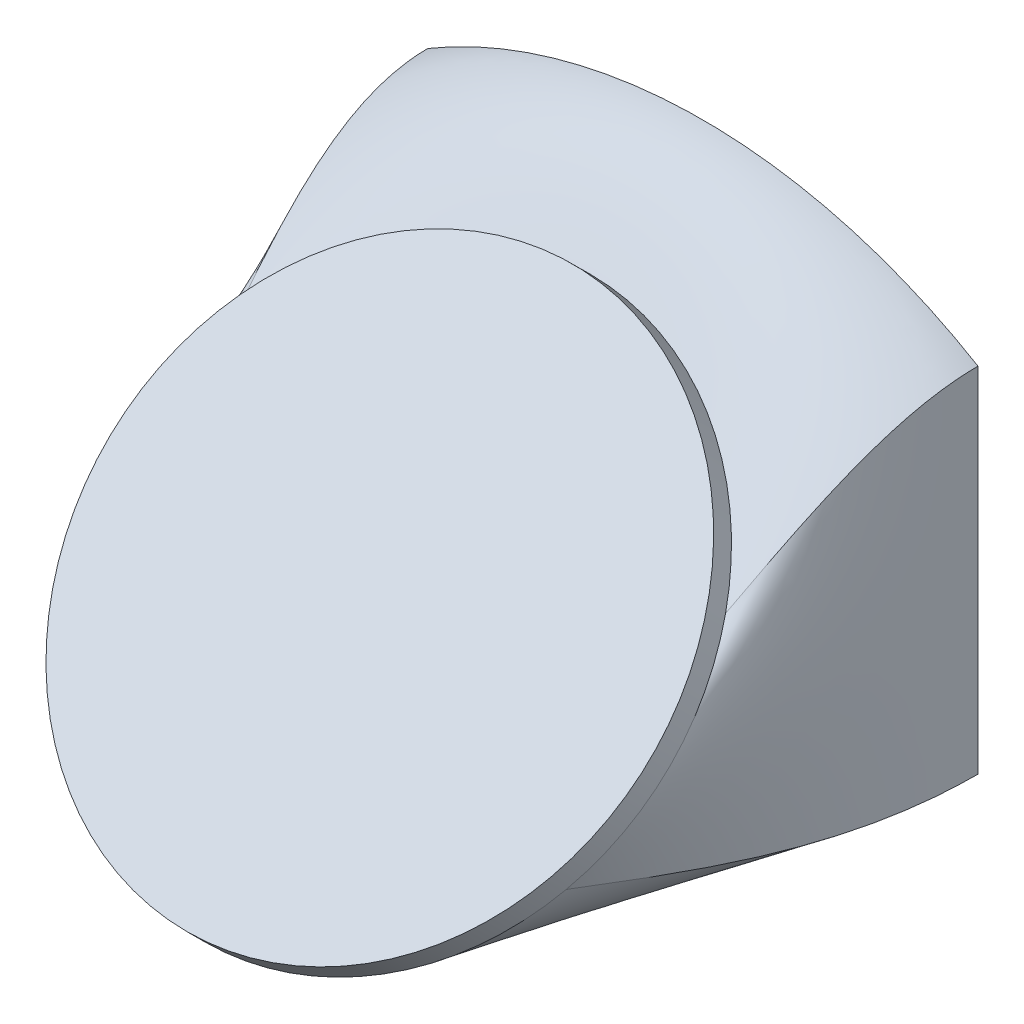
ISO-10303-21;
HEADER;
FILE_DESCRIPTION(('STEP AP214'),'2;1');
FILE_NAME('part.step','',(''),(''),'','','');
FILE_SCHEMA(('AUTOMOTIVE_DESIGN { 1 0 10303 214 1 1 1 1 }'));
ENDSEC;
DATA;
#1=APPLICATION_CONTEXT('core data for automotive mechanical design processes');
#2=APPLICATION_PROTOCOL_DEFINITION('international standard','automotive_design',2000,#1);
#3=PRODUCT_CONTEXT('',#1,'mechanical');
#4=PRODUCT('Part','Part','',(#3));
#5=PRODUCT_RELATED_PRODUCT_CATEGORY('part','',(#4));
#6=PRODUCT_DEFINITION_FORMATION('','',#4);
#7=PRODUCT_DEFINITION_CONTEXT('part definition',#1,'design');
#8=PRODUCT_DEFINITION('design','',#6,#7);
#9=PRODUCT_DEFINITION_SHAPE('','',#8);
#10=(LENGTH_UNIT() NAMED_UNIT(*) SI_UNIT(.MILLI.,.METRE.));
#11=(NAMED_UNIT(*) PLANE_ANGLE_UNIT() SI_UNIT($,.RADIAN.));
#12=(NAMED_UNIT(*) SI_UNIT($,.STERADIAN.) SOLID_ANGLE_UNIT());
#13=UNCERTAINTY_MEASURE_WITH_UNIT(LENGTH_MEASURE(1.E-05),#10,'distance_accuracy_value','');
#14=(GEOMETRIC_REPRESENTATION_CONTEXT(3) GLOBAL_UNCERTAINTY_ASSIGNED_CONTEXT((#13)) GLOBAL_UNIT_ASSIGNED_CONTEXT((#10,
#11,#12)) REPRESENTATION_CONTEXT('',''));
#15=CARTESIAN_POINT('',(0.,0.,0.));
#16=DIRECTION('',(0.,0.,1.));
#17=DIRECTION('',(1.,0.,0.));
#18=AXIS2_PLACEMENT_3D('',#15,#16,#17);
#19=CARTESIAN_POINT('',(0.,56.5083333333335,0.));
#20=DIRECTION('',(0.,0.,1.));
#21=DIRECTION('',(1.,0.,0.));
#22=AXIS2_PLACEMENT_3D('',#19,#20,#21);
#23=PLANE('',#22);
#24=CARTESIAN_POINT('',(0.,56.5083333333335,0.));
#25=DIRECTION('',(0.,0.,1.));
#26=DIRECTION('',(1.,0.,0.));
#27=AXIS2_PLACEMENT_3D('',#24,#25,#26);
#28=CIRCLE('',#27,106.508333333334);
#29=CARTESIAN_POINT('',(-54.5,-35.,0.));
#30=VERTEX_POINT('',#29);
#31=CARTESIAN_POINT('',(54.5,-35.,0.));
#32=VERTEX_POINT('',#31);
#33=EDGE_CURVE('E213',#30,#32,#28,.T.);
#34=ORIENTED_EDGE('',*,*,#33,.F.);
#35=DIRECTION('',(0.,-1.,0.));
#36=VECTOR('',#35,1.);
#37=CARTESIAN_POINT('',(-54.5,35.,0.));
#38=LINE('',#37,#36);
#39=CARTESIAN_POINT('',(-54.5,35.,0.));
#40=VERTEX_POINT('',#39);
#41=EDGE_CURVE('E12',#40,#30,#38,.T.);
#42=ORIENTED_EDGE('',*,*,#41,.F.);
#43=CARTESIAN_POINT('',(0.,-56.5083333333334,0.));
#44=DIRECTION('',(0.,0.,1.));
#45=DIRECTION('',(-1.,0.,0.));
#46=AXIS2_PLACEMENT_3D('',#43,#44,#45);
#47=CIRCLE('',#46,106.508333333333);
#48=CARTESIAN_POINT('',(54.5,35.,0.));
#49=VERTEX_POINT('',#48);
#50=EDGE_CURVE('E139',#49,#40,#47,.T.);
#51=ORIENTED_EDGE('',*,*,#50,.F.);
#52=DIRECTION('',(0.,1.,0.));
#53=VECTOR('',#52,1.);
#54=CARTESIAN_POINT('',(54.5,35.,0.));
#55=LINE('',#54,#53);
#56=EDGE_CURVE('E294',#32,#49,#55,.T.);
#57=ORIENTED_EDGE('',*,*,#56,.F.);
#58=EDGE_LOOP('',(#34,#42,#51,#57));
#59=FACE_BOUND('',#58,.T.);
#60=ADVANCED_FACE('F129',(#59),#23,.F.);
#61=CARTESIAN_POINT('',(49.1679396402326,12.2523366207476,44.6765955673871));
#62=CARTESIAN_POINT('',(51.8339698201163,23.6261683103738,30.7411498927294));
#63=CARTESIAN_POINT('',(54.5,35.,16.8057042180718));
#64=CARTESIAN_POINT('',(54.5,35.,0.));
#65=CARTESIAN_POINT('',(55.610300295625,2.22066074306521,54.7082714450694));
#66=CARTESIAN_POINT('',(55.0551501478125,6.94366370486594,37.2910102358226));
#67=CARTESIAN_POINT('',(54.5,11.6666666666667,19.8737490265758));
#68=CARTESIAN_POINT('',(54.5,11.6666666666667,0.));
#69=CARTESIAN_POINT('',(55.610300295625,-9.29172855493061,66.2206607430652));
#70=CARTESIAN_POINT('',(55.0551501478125,-10.4791976107986,44.5812272890725));
#71=CARTESIAN_POINT('',(54.5,-11.6666666666667,22.9417938350798));
#72=CARTESIAN_POINT('',(54.5,-11.6666666666667,0.));
#73=CARTESIAN_POINT('',(49.1679396402327,-19.323404432613,76.2523366207475));
#74=CARTESIAN_POINT('',(51.8339698201163,-27.1617022163065,51.1310876321657));
#75=CARTESIAN_POINT('',(54.5,-35.,26.0098386435839));
#76=CARTESIAN_POINT('',(54.5,-35.,0.));
#77=B_SPLINE_SURFACE_WITH_KNOTS('',3,3,((#61,#62,#63,#64),(#65,#66,#67,#68),(#69,#70,#71,#72),
(#73,#74,#75,#76)),.UNSPECIFIED.,.F.,.F.,.F.,(4,4),(4,4),(0.,1.),(0.,1.),.UNSPECIFIED.);
#78=CARTESIAN_POINT('',(0.,-3.53553390593271,60.4644660940673));
#79=DIRECTION('',(0.,-0.707106781186546,-0.707106781186549));
#80=DIRECTION('',(0.,0.707106781186549,-0.707106781186546));
#81=AXIS2_PLACEMENT_3D('',#78,#79,#80);
#82=CIRCLE('',#81,54.);
#83=CARTESIAN_POINT('',(49.1679396402327,12.2523366207476,44.676595567387));
#84=VERTEX_POINT('',#83);
#85=CARTESIAN_POINT('',(53.4481201590153,1.91123804463501,55.0176941434996));
#86=VERTEX_POINT('',#85);
#87=EDGE_CURVE('E195',#84,#86,#82,.T.);
#88=CARTESIAN_POINT('',(0.,-3.53553390593271,60.4644660940673));
#89=DIRECTION('',(0.,0.707106781186546,0.707106781186549));
#90=DIRECTION('',(0.,-0.707106781186549,0.707106781186546));
#91=AXIS2_PLACEMENT_3D('',#88,#89,#90);
#92=CIRCLE('',#91,54.);
#93=CARTESIAN_POINT('',(49.1679396402327,-19.323404432613,76.2523366207475));
#94=VERTEX_POINT('',#93);
#95=EDGE_CURVE('E188',#94,#86,#92,.T.);
#96=CARTESIAN_POINT('',(49.1679396402327,-19.323404432613,76.2523366207475));
#97=CARTESIAN_POINT('',(51.8339698201163,-27.1617022163065,51.1310876321657));
#98=CARTESIAN_POINT('',(54.5,-35.,26.0098386435839));
#99=CARTESIAN_POINT('',(54.5,-35.,0.));
#100=B_SPLINE_CURVE_WITH_KNOTS('',3,(#96,#97,#98,#99),.UNSPECIFIED.,.F.,.F.,(4,4),(0.,1.),.UNSPECIFIED.);
#101=EDGE_CURVE('E204',#94,#32,#100,.T.);
#102=CARTESIAN_POINT('',(49.1679396402326,12.2523366207476,44.6765955673871));
#103=CARTESIAN_POINT('',(51.8339698201163,23.6261683103738,30.7411498927294));
#104=CARTESIAN_POINT('',(54.5,35.,16.8057042180718));
#105=CARTESIAN_POINT('',(54.5,35.,0.));
#106=B_SPLINE_CURVE_WITH_KNOTS('',3,(#102,#103,#104,#105),.UNSPECIFIED.,.F.,.F.,(4,4),(0.,1.),.UNSPECIFIED.);
#107=EDGE_CURVE('E215',#49,#84,#106,.F.);
#108=ORIENTED_EDGE('',*,*,#87,.T.);
#109=ORIENTED_EDGE('',*,*,#95,.F.);
#110=ORIENTED_EDGE('',*,*,#101,.T.);
#111=ORIENTED_EDGE('',*,*,#56,.T.);
#112=ORIENTED_EDGE('',*,*,#107,.T.);
#113=EDGE_LOOP('',(#108,#109,#110,#111,#112));
#114=FACE_BOUND('',#113,.T.);
#115=ADVANCED_FACE('F202',(#114),#77,.T.);
#116=CARTESIAN_POINT('',(49.1679396402327,-19.323404432613,76.2523366207475));
#117=CARTESIAN_POINT('',(51.8339698201163,-27.1617022163065,51.1310876321657));
#118=CARTESIAN_POINT('',(54.5,-35.,26.0098386435839));
#119=CARTESIAN_POINT('',(54.5,-35.,0.));
#120=CARTESIAN_POINT('',(48.073339624932,-21.0278530278668,77.9567852160013));
#121=CARTESIAN_POINT('',(50.2374276584303,-28.6388280427007,52.2312643576387));
#122=CARTESIAN_POINT('',(52.4015156919287,-36.2498030575345,26.505743499276));
#123=CARTESIAN_POINT('',(52.4015156919287,-36.2498030575345,0.));
#124=CARTESIAN_POINT('',(45.5571007663625,-24.2843976600411,81.2133298481757));
#125=CARTESIAN_POINT('',(46.8485084788376,-31.4387907252264,54.3554415294181));
#126=CARTESIAN_POINT('',(48.1399161913127,-38.5931837904117,27.4975532106604));
#127=CARTESIAN_POINT('',(48.1399161913127,-38.5931837904117,0.));
#128=CARTESIAN_POINT('',(40.899220883751,-28.6666292962474,85.5955614843818));
#129=CARTESIAN_POINT('',(41.2385408761988,-35.1531040196998,57.2247483336345));
#130=CARTESIAN_POINT('',(41.5778608686466,-41.6395787431521,28.8539351828873));
#131=CARTESIAN_POINT('',(41.5778608686466,-41.6395787431521,0.));
#132=CARTESIAN_POINT('',(35.4617114194411,-32.5007479833435,89.4296801714781));
#133=CARTESIAN_POINT('',(35.1660487376783,-38.3590227663302,59.7464935191303));
#134=CARTESIAN_POINT('',(34.8703860559156,-44.217297549317,30.0633068667825));
#135=CARTESIAN_POINT('',(34.8703860559156,-44.217297549317,0.));
#136=CARTESIAN_POINT('',(29.3372660159594,-35.7412260842746,92.670158272409));
#137=CARTESIAN_POINT('',(28.6894971753783,-41.0337831465905,61.8814100326841));
#138=CARTESIAN_POINT('',(28.0417283347972,-46.3263402089065,31.0926617929592));
#139=CARTESIAN_POINT('',(28.0417283347972,-46.3263402089065,0.));
#140=CARTESIAN_POINT('',(22.6393007026018,-38.3425359619853,95.2714681501198));
#141=CARTESIAN_POINT('',(21.8777124947854,-43.1546213419529,63.5968208403101));
#142=CARTESIAN_POINT('',(21.116124286969,-47.9667067219206,31.9221735305004));
#143=CARTESIAN_POINT('',(21.116124286969,-47.9667067219206,0.));
#144=CARTESIAN_POINT('',(15.4425752631285,-40.259149979421,97.1880821675553));
#145=CARTESIAN_POINT('',(14.7801928786185,-44.6987735338901,64.860821942633));
#146=CARTESIAN_POINT('',(14.1178104941085,-49.1383970883592,32.5335617177107));
#147=CARTESIAN_POINT('',(14.1178104941085,-49.1383970883592,0.));
#148=CARTESIAN_POINT('',(7.8948919450744,-41.4455404995262,98.3744726876607));
#149=CARTESIAN_POINT('',(7.48295774148367,-45.6434759038743,65.6429879027502));
#150=CARTESIAN_POINT('',(7.07102353789294,-49.8414113082225,32.9115031178397));
#151=CARTESIAN_POINT('',(7.07102353789294,-49.8414113082225,0.));
#152=CARTESIAN_POINT('',(0.,-41.8561798852464,98.7851120733807));
#153=CARTESIAN_POINT('',(0.,-45.9659646333783,65.9134233925793));
#154=CARTESIAN_POINT('',(0.,-50.0757493815102,33.0417347117779));
#155=CARTESIAN_POINT('',(0.,-50.0757493815102,0.));
#156=CARTESIAN_POINT('',(-7.89489194507439,-41.4455404995263,98.3744726876608));
#157=CARTESIAN_POINT('',(-7.4829577414837,-45.6434759038744,65.6429879027503));
#158=CARTESIAN_POINT('',(-7.071023537893,-49.8414113082225,32.9115031178398));
#159=CARTESIAN_POINT('',(-7.071023537893,-49.8414113082225,0.));
#160=CARTESIAN_POINT('',(-15.4425752631284,-40.259149979421,97.1880821675553));
#161=CARTESIAN_POINT('',(-14.7801928786184,-44.6987735338901,64.860821942633));
#162=CARTESIAN_POINT('',(-14.1178104941085,-49.1383970883593,32.5335617177107));
#163=CARTESIAN_POINT('',(-14.1178104941085,-49.1383970883593,0.));
#164=CARTESIAN_POINT('',(-22.6393007026019,-38.3425359619853,95.2714681501199));
#165=CARTESIAN_POINT('',(-21.8777124947855,-43.154621341953,63.5968208403102));
#166=CARTESIAN_POINT('',(-21.1161242869691,-47.9667067219207,31.9221735305005));
#167=CARTESIAN_POINT('',(-21.1161242869691,-47.9667067219207,0.));
#168=CARTESIAN_POINT('',(-29.3372660159592,-35.7412260842747,92.6701582724089));
#169=CARTESIAN_POINT('',(-28.6894971753782,-41.0337831465906,61.881410032684));
#170=CARTESIAN_POINT('',(-28.0417283347973,-46.3263402089066,31.0926617929592));
#171=CARTESIAN_POINT('',(-28.0417283347973,-46.3263402089066,0.));
#172=CARTESIAN_POINT('',(-35.4617114194413,-32.5007479833435,89.4296801714783));
#173=CARTESIAN_POINT('',(-35.1660487376784,-38.3590227663303,59.7464935191304));
#174=CARTESIAN_POINT('',(-34.8703860559156,-44.2172975493171,30.0633068667825));
#175=CARTESIAN_POINT('',(-34.8703860559156,-44.2172975493171,0.));
#176=CARTESIAN_POINT('',(-40.8992208837508,-28.6666292962476,85.5955614843817));
#177=CARTESIAN_POINT('',(-41.2385408761987,-35.1531040196998,57.2247483336345));
#178=CARTESIAN_POINT('',(-41.5778608686466,-41.6395787431521,28.8539351828873));
#179=CARTESIAN_POINT('',(-41.5778608686466,-41.6395787431521,0.));
#180=CARTESIAN_POINT('',(-45.5571007663625,-24.2843976600411,81.2133298481758));
#181=CARTESIAN_POINT('',(-46.8485084788376,-31.4387907252264,54.3554415294181));
#182=CARTESIAN_POINT('',(-48.1399161913128,-38.5931837904117,27.4975532106604));
#183=CARTESIAN_POINT('',(-48.1399161913128,-38.5931837904117,0.));
#184=CARTESIAN_POINT('',(-48.073339624932,-21.0278530278669,77.9567852160014));
#185=CARTESIAN_POINT('',(-50.2374276584304,-28.6388280427007,52.2312643576387));
#186=CARTESIAN_POINT('',(-52.4015156919287,-36.2498030575345,26.5057434992761));
#187=CARTESIAN_POINT('',(-52.4015156919287,-36.2498030575345,0.));
#188=CARTESIAN_POINT('',(-49.1679396402326,-19.323404432613,76.2523366207475));
#189=CARTESIAN_POINT('',(-51.8339698201163,-27.1617022163065,51.1310876321657));
#190=CARTESIAN_POINT('',(-54.5,-35.,26.0098386435839));
#191=CARTESIAN_POINT('',(-54.5,-35.,0.));
#192=B_SPLINE_SURFACE_WITH_KNOTS('',3,3,((#116,#117,#118,#119),(#120,#121,#122,#123),(#124,#125,
#126,#127),(#128,#129,#130,#131),(#132,#133,#134,#135),(#136,#137,#138,#139),(#140,#141,#142,
#143),(#144,#145,#146,#147),(#148,#149,#150,#151),(#152,#153,#154,#155),(#156,#157,#158,#159),
(#160,#161,#162,#163),(#164,#165,#166,#167),(#168,#169,#170,#171),(#172,#173,#174,#175),(#176,
#177,#178,#179),(#180,#181,#182,#183),(#184,#185,#186,#187),(#188,#189,#190,#191)),
.UNSPECIFIED.,.F.,.F.,.F.,(4,1,1,1,1,1,1,1,1,1,1,1,1,1,1,1,4),(4,4),(0.,0.0625,0.125,0.1875,
0.25,0.3125,0.375,0.4375,0.5,0.5625,0.625,0.6875,0.75,0.8125,0.875,0.9375,1.),(0.,1.),.UNSPECIFIED.);
#193=CARTESIAN_POINT('',(-49.1679396402327,-19.323404432613,76.2523366207475));
#194=VERTEX_POINT('',#193);
#195=EDGE_CURVE('E183',#94,#194,#82,.T.);
#196=CARTESIAN_POINT('',(-49.1679396402326,-19.323404432613,76.2523366207475));
#197=CARTESIAN_POINT('',(-51.8339698201163,-27.1617022163065,51.1310876321657));
#198=CARTESIAN_POINT('',(-54.5,-35.,26.0098386435839));
#199=CARTESIAN_POINT('',(-54.5,-35.,0.));
#200=B_SPLINE_CURVE_WITH_KNOTS('',3,(#196,#197,#198,#199),.UNSPECIFIED.,.F.,.F.,(4,4),(0.,1.),.UNSPECIFIED.);
#201=EDGE_CURVE('E155',#194,#30,#200,.T.);
#202=ORIENTED_EDGE('',*,*,#195,.T.);
#203=ORIENTED_EDGE('',*,*,#201,.T.);
#204=ORIENTED_EDGE('',*,*,#33,.T.);
#205=ORIENTED_EDGE('',*,*,#101,.F.);
#206=EDGE_LOOP('',(#202,#203,#204,#205));
#207=FACE_BOUND('',#206,.T.);
#208=ADVANCED_FACE('F211',(#207),#192,.T.);
#209=CARTESIAN_POINT('',(-49.1679396402326,12.2523366207475,44.6765955673871));
#210=CARTESIAN_POINT('',(-51.8339698201163,23.6261683103738,30.7411498927294));
#211=CARTESIAN_POINT('',(-54.5,35.,16.8057042180718));
#212=CARTESIAN_POINT('',(-54.5,35.,0.));
#213=CARTESIAN_POINT('',(-48.073339624932,13.9567852160014,42.9721469721332));
#214=CARTESIAN_POINT('',(-50.2374276584303,25.103294136768,29.5953387366301));
#215=CARTESIAN_POINT('',(-52.4015156919286,36.2498030575345,16.218530501127));
#216=CARTESIAN_POINT('',(-52.4015156919286,36.2498030575345,0.));
#217=CARTESIAN_POINT('',(-45.5571007663626,17.2133298481757,39.7156023399589));
#218=CARTESIAN_POINT('',(-46.8485084788376,27.9032568192937,27.3798927035982));
#219=CARTESIAN_POINT('',(-48.1399161913127,38.5931837904118,15.0441830672375));
#220=CARTESIAN_POINT('',(-48.1399161913127,38.5931837904118,0.));
#221=CARTESIAN_POINT('',(-40.8992208837509,21.595561484382,35.3333707037527));
#222=CARTESIAN_POINT('',(-41.2385408761987,31.617570113767,24.4372512993189));
#223=CARTESIAN_POINT('',(-41.5778608686465,41.6395787431521,13.5411318948852));
#224=CARTESIAN_POINT('',(-41.5778608686465,41.6395787431521,0.));
#225=CARTESIAN_POINT('',(-35.4617114194412,25.4296801714782,31.4992520166564));
#226=CARTESIAN_POINT('',(-35.1660487376784,34.8234888603976,21.8616031457889));
#227=CARTESIAN_POINT('',(-34.8703860559155,44.217297549317,12.2239542749214));
#228=CARTESIAN_POINT('',(-34.8703860559155,44.217297549317,0.));
#229=CARTESIAN_POINT('',(-29.3372660159594,28.6701582724091,28.2587739157256));
#230=CARTESIAN_POINT('',(-28.6894971753783,37.4982492406578,19.6865889614701));
#231=CARTESIAN_POINT('',(-28.0417283347972,46.3263402089065,11.1144040072145));
#232=CARTESIAN_POINT('',(-28.0417283347972,46.3263402089065,0.));
#233=CARTESIAN_POINT('',(-22.6393007026018,31.27146815012,25.6574640380147));
#234=CARTESIAN_POINT('',(-21.8777124947854,39.6190874360203,17.9366278040711));
#235=CARTESIAN_POINT('',(-21.116124286969,47.9667067219206,10.2157915701274));
#236=CARTESIAN_POINT('',(-21.116124286969,47.9667067219206,0.));
#237=CARTESIAN_POINT('',(-15.4425752631285,33.1880821675554,23.7408500205793));
#238=CARTESIAN_POINT('',(-14.7801928786184,41.1632396279573,16.6422897701871));
#239=CARTESIAN_POINT('',(-14.1178104941084,49.1383970883593,9.54372951979502));
#240=CARTESIAN_POINT('',(-14.1178104941084,49.1383970883593,0.));
#241=CARTESIAN_POINT('',(-7.8948919450744,34.3744726876609,22.5544595004738));
#242=CARTESIAN_POINT('',(-7.48295774148367,42.1079419979417,15.8368829028073));
#243=CARTESIAN_POINT('',(-7.07102353789294,49.8414113082225,9.11930630514079));
#244=CARTESIAN_POINT('',(-7.07102353789294,49.8414113082225,0.));
#245=CARTESIAN_POINT('',(0.,34.7851120733809,22.1438201147538));
#246=CARTESIAN_POINT('',(0.,42.4304307274456,15.5561142888401));
#247=CARTESIAN_POINT('',(0.,50.0757493815103,8.96840846292647));
#248=CARTESIAN_POINT('',(0.,50.0757493815103,0.));
#249=CARTESIAN_POINT('',(7.8948919450744,34.3744726876609,22.5544595004739));
#250=CARTESIAN_POINT('',(7.4829577414837,42.1079419979417,15.8368829028073));
#251=CARTESIAN_POINT('',(7.07102353789299,49.8414113082226,9.11930630514081));
#252=CARTESIAN_POINT('',(7.07102353789299,49.8414113082226,0.));
#253=CARTESIAN_POINT('',(15.4425752631284,33.1880821675555,23.7408500205792));
#254=CARTESIAN_POINT('',(14.7801928786184,41.1632396279574,16.6422897701871));
#255=CARTESIAN_POINT('',(14.1178104941085,49.1383970883593,9.543729519795));
#256=CARTESIAN_POINT('',(14.1178104941085,49.1383970883593,0.));
#257=CARTESIAN_POINT('',(22.6393007026019,31.2714681501198,25.6574640380148));
#258=CARTESIAN_POINT('',(21.8777124947855,39.6190874360203,17.9366278040711));
#259=CARTESIAN_POINT('',(21.1161242869691,47.9667067219207,10.2157915701275));
#260=CARTESIAN_POINT('',(21.1161242869691,47.9667067219207,0.));
#261=CARTESIAN_POINT('',(29.3372660159592,28.6701582724093,28.2587739157255));
#262=CARTESIAN_POINT('',(28.6894971753782,37.4982492406579,19.68658896147));
#263=CARTESIAN_POINT('',(28.0417283347972,46.3263402089066,11.1144040072145));
#264=CARTESIAN_POINT('',(28.0417283347972,46.3263402089066,0.));
#265=CARTESIAN_POINT('',(35.4617114194413,25.4296801714781,31.4992520166565));
#266=CARTESIAN_POINT('',(35.1660487376784,34.8234888603976,21.861603145789));
#267=CARTESIAN_POINT('',(34.8703860559155,44.2172975493171,12.2239542749215));
#268=CARTESIAN_POINT('',(34.8703860559155,44.2172975493171,0.));
#269=CARTESIAN_POINT('',(40.8992208837508,21.5955614843821,35.3333707037527));
#270=CARTESIAN_POINT('',(41.2385408761987,31.6175701137671,24.4372512993189));
#271=CARTESIAN_POINT('',(41.5778608686465,41.6395787431521,13.5411318948851));
#272=CARTESIAN_POINT('',(41.5778608686465,41.6395787431521,0.));
#273=CARTESIAN_POINT('',(45.5571007663625,17.2133298481757,39.7156023399589));
#274=CARTESIAN_POINT('',(46.8485084788376,27.9032568192937,27.3798927035982));
#275=CARTESIAN_POINT('',(48.1399161913127,38.5931837904118,15.0441830672375));
#276=CARTESIAN_POINT('',(48.1399161913127,38.5931837904118,0.));
#277=CARTESIAN_POINT('',(48.073339624932,13.9567852160014,42.9721469721332));
#278=CARTESIAN_POINT('',(50.2374276584303,25.103294136768,29.5953387366301));
#279=CARTESIAN_POINT('',(52.4015156919286,36.2498030575345,16.218530501127));
#280=CARTESIAN_POINT('',(52.4015156919286,36.2498030575345,0.));
#281=CARTESIAN_POINT('',(49.1679396402326,12.2523366207476,44.6765955673871));
#282=CARTESIAN_POINT('',(51.8339698201163,23.6261683103738,30.7411498927294));
#283=CARTESIAN_POINT('',(54.5,35.,16.8057042180718));
#284=CARTESIAN_POINT('',(54.5,35.,0.));
#285=B_SPLINE_SURFACE_WITH_KNOTS('',3,3,((#209,#210,#211,#212),(#213,#214,#215,#216),(#217,#218,
#219,#220),(#221,#222,#223,#224),(#225,#226,#227,#228),(#229,#230,#231,#232),(#233,#234,#235,
#236),(#237,#238,#239,#240),(#241,#242,#243,#244),(#245,#246,#247,#248),(#249,#250,#251,#252),
(#253,#254,#255,#256),(#257,#258,#259,#260),(#261,#262,#263,#264),(#265,#266,#267,#268),(#269,
#270,#271,#272),(#273,#274,#275,#276),(#277,#278,#279,#280),(#281,#282,#283,#284)),
.UNSPECIFIED.,.F.,.F.,.F.,(4,1,1,1,1,1,1,1,1,1,1,1,1,1,1,1,4),(4,4),(0.,0.0625,0.125,0.1875,
0.25,0.3125,0.375,0.4375,0.5,0.5625,0.625,0.6875,0.75,0.8125,0.875,0.9375,1.),(0.,1.),.UNSPECIFIED.);
#286=CARTESIAN_POINT('',(-49.1679396402327,12.2523366207476,44.676595567387));
#287=VERTEX_POINT('',#286);
#288=CARTESIAN_POINT('',(-32.3814886689917,27.0206652356814,29.9082669524533));
#289=VERTEX_POINT('',#288);
#290=EDGE_CURVE('E433',#287,#289,#82,.T.);
#291=CARTESIAN_POINT('',(32.3814535617229,27.0207008444264,29.9082313437083));
#292=VERTEX_POINT('',#291);
#293=EDGE_CURVE('E364',#292,#289,#92,.T.);
#294=EDGE_CURVE('E207',#84,#292,#92,.T.);
#295=CARTESIAN_POINT('',(-49.1679396402327,12.2523366207476,44.676595567387));
#296=CARTESIAN_POINT('',(-51.8339698201163,23.6261683103738,30.7411498927294));
#297=CARTESIAN_POINT('',(-54.5,35.,16.8057042180718));
#298=CARTESIAN_POINT('',(-54.5,35.,0.));
#299=B_SPLINE_CURVE_WITH_KNOTS('',3,(#295,#296,#297,#298),.UNSPECIFIED.,.F.,.F.,(4,4),(0.,1.),.UNSPECIFIED.);
#300=EDGE_CURVE('E217',#287,#40,#299,.T.);
#301=CARTESIAN_POINT('',(-49.1675077433435,12.2504940600138,44.6788531095863));
#302=CARTESIAN_POINT('',(-49.1676517089732,12.2511082469251,44.6781005955199));
#303=CARTESIAN_POINT('',(-49.1677956746029,12.2517224338363,44.6773480814535));
#304=CARTESIAN_POINT('',(-49.1679396402326,12.2523366207475,44.6765955673871));
#305=CARTESIAN_POINT('',(-51.8339698201163,23.6261683103738,30.7411498927294));
#306=CARTESIAN_POINT('',(-54.5,35.,16.8057042180718));
#307=CARTESIAN_POINT('',(-54.5,35.,0.));
#308=CARTESIAN_POINT('',(-48.0729890426706,13.9549794815562,42.9743140150674));
#309=CARTESIAN_POINT('',(-48.0731059034244,13.955581393038,42.9735916674226));
#310=CARTESIAN_POINT('',(-48.0732227641782,13.9561833045197,42.9728693197779));
#311=CARTESIAN_POINT('',(-48.073339624932,13.9567852160014,42.9721469721332));
#312=CARTESIAN_POINT('',(-50.2374276584303,25.103294136768,29.5953387366301));
#313=CARTESIAN_POINT('',(-52.4015156919286,36.2498030575345,16.218530501127));
#314=CARTESIAN_POINT('',(-52.4015156919286,36.2498030575345,0.));
#315=CARTESIAN_POINT('',(-45.5568915583131,17.2115980800064,39.71760072492));
#316=CARTESIAN_POINT('',(-45.5569612943296,17.2121753360629,39.7169345965996));
#317=CARTESIAN_POINT('',(-45.5570310303461,17.2127525921193,39.7162684682793));
#318=CARTESIAN_POINT('',(-45.5571007663626,17.2133298481757,39.7156023399589));
#319=CARTESIAN_POINT('',(-46.8485084788376,27.9032568192937,27.3798927035982));
#320=CARTESIAN_POINT('',(-48.1399161913127,38.5931837904118,15.0441830672375));
#321=CARTESIAN_POINT('',(-48.1399161913127,38.5931837904118,0.));
#322=CARTESIAN_POINT('',(-40.8991659139121,21.593937918984,35.3351358750962));
#323=CARTESIAN_POINT('',(-40.8991842371917,21.59447910745,35.3345474846483));
#324=CARTESIAN_POINT('',(-40.8992025604713,21.595020295916,35.3339590942005));
#325=CARTESIAN_POINT('',(-40.8992208837509,21.595561484382,35.3333707037527));
#326=CARTESIAN_POINT('',(-41.2385408761987,31.617570113767,24.4372512993189));
#327=CARTESIAN_POINT('',(-41.5778608686465,41.6395787431521,13.5411318948852));
#328=CARTESIAN_POINT('',(-41.5778608686465,41.6395787431521,0.));
#329=CARTESIAN_POINT('',(-35.4617593167956,25.4281583744706,31.5008133157735));
#330=CARTESIAN_POINT('',(-35.4617433510108,25.4286656401398,31.5002928827345));
#331=CARTESIAN_POINT('',(-35.461727385226,25.429172905809,31.4997724496955));
#332=CARTESIAN_POINT('',(-35.4617114194412,25.4296801714782,31.4992520166564));
#333=CARTESIAN_POINT('',(-35.1660487376784,34.8234888603976,21.8616031457889));
#334=CARTESIAN_POINT('',(-34.8703860559155,44.217297549317,12.2239542749214));
#335=CARTESIAN_POINT('',(-34.8703860559155,44.217297549317,0.));
#336=CARTESIAN_POINT('',(-29.3373709545115,28.6687281216722,28.2601626096882));
#337=CARTESIAN_POINT('',(-29.3373359749942,28.6692048385845,28.2596997117007));
#338=CARTESIAN_POINT('',(-29.3373009954768,28.6696815554968,28.2592368137131));
#339=CARTESIAN_POINT('',(-29.3372660159594,28.6701582724091,28.2587739157256));
#340=CARTESIAN_POINT('',(-28.6894971753783,37.4982492406578,19.6865889614701));
#341=CARTESIAN_POINT('',(-28.0417283347972,46.3263402089065,11.1144040072145));
#342=CARTESIAN_POINT('',(-28.0417283347972,46.3263402089065,0.));
#343=CARTESIAN_POINT('',(-22.6394240798915,31.2701158357956,25.6587148134846));
#344=CARTESIAN_POINT('',(-22.6393829541283,31.2705666072371,25.658297888328));
#345=CARTESIAN_POINT('',(-22.6393418283651,31.2710173786785,25.6578809631714));
#346=CARTESIAN_POINT('',(-22.6393007026018,31.27146815012,25.6574640380147));
#347=CARTESIAN_POINT('',(-21.8777124947854,39.6190874360203,17.9366278040711));
#348=CARTESIAN_POINT('',(-21.116124286969,47.9667067219206,10.2157915701274));
#349=CARTESIAN_POINT('',(-21.116124286969,47.9667067219206,0.));
#350=CARTESIAN_POINT('',(-15.4426825690747,33.1867901920468,23.7419999873398));
#351=CARTESIAN_POINT('',(-15.442646800426,33.1872208505497,23.7416166650863));
#352=CARTESIAN_POINT('',(-15.4426110317772,33.1876515090526,23.7412333428328));
#353=CARTESIAN_POINT('',(-15.4425752631285,33.1880821675554,23.7408500205793));
#354=CARTESIAN_POINT('',(-14.7801928786184,41.1632396279573,16.6422897701871));
#355=CARTESIAN_POINT('',(-14.1178104941084,49.1383970883593,9.54372951979502));
#356=CARTESIAN_POINT('',(-14.1178104941084,49.1383970883593,0.));
#357=CARTESIAN_POINT('',(-7.89495867841538,34.3732198656326,22.5555477478826));
#358=CARTESIAN_POINT('',(-7.89493643396839,34.3736374729754,22.5551849987464));
#359=CARTESIAN_POINT('',(-7.89491418952139,34.3740550803182,22.5548222496101));
#360=CARTESIAN_POINT('',(-7.8948919450744,34.3744726876609,22.5544595004738));
#361=CARTESIAN_POINT('',(-7.48295774148367,42.1079419979417,15.8368829028073));
#362=CARTESIAN_POINT('',(-7.07102353789294,49.8414113082225,9.11930630514079));
#363=CARTESIAN_POINT('',(-7.07102353789294,49.8414113082225,0.));
#364=CARTESIAN_POINT('',(0.,34.7838735317589,22.1448873230976));
#365=CARTESIAN_POINT('',(0.,34.7842863789663,22.144531586983));
#366=CARTESIAN_POINT('',(0.,34.7846992261736,22.1441758508684));
#367=CARTESIAN_POINT('',(0.,34.7851120733809,22.1438201147538));
#368=CARTESIAN_POINT('',(0.,42.4304307274456,15.5561142888401));
#369=CARTESIAN_POINT('',(0.,50.0757493815103,8.96840846292647));
#370=CARTESIAN_POINT('',(0.,50.0757493815103,0.));
#371=CARTESIAN_POINT('',(7.89495867841538,34.3732198656326,22.5555477478827));
#372=CARTESIAN_POINT('',(7.89493643396839,34.3736374729753,22.5551849987464));
#373=CARTESIAN_POINT('',(7.89491418952139,34.3740550803181,22.5548222496101));
#374=CARTESIAN_POINT('',(7.8948919450744,34.3744726876609,22.5544595004739));
#375=CARTESIAN_POINT('',(7.4829577414837,42.1079419979417,15.8368829028073));
#376=CARTESIAN_POINT('',(7.07102353789299,49.8414113082226,9.11930630514081));
#377=CARTESIAN_POINT('',(7.07102353789299,49.8414113082226,0.));
#378=CARTESIAN_POINT('',(15.4426825690747,33.1867901920469,23.7419999873398));
#379=CARTESIAN_POINT('',(15.4426468004259,33.1872208505498,23.7416166650863));
#380=CARTESIAN_POINT('',(15.4426110317772,33.1876515090527,23.7412333428328));
#381=CARTESIAN_POINT('',(15.4425752631284,33.1880821675555,23.7408500205792));
#382=CARTESIAN_POINT('',(14.7801928786184,41.1632396279574,16.6422897701871));
#383=CARTESIAN_POINT('',(14.1178104941085,49.1383970883593,9.543729519795));
#384=CARTESIAN_POINT('',(14.1178104941085,49.1383970883593,0.));
#385=CARTESIAN_POINT('',(22.6394240798915,31.2701158357955,25.6587148134847));
#386=CARTESIAN_POINT('',(22.6393829541283,31.270566607237,25.658297888328));
#387=CARTESIAN_POINT('',(22.6393418283651,31.2710173786784,25.6578809631714));
#388=CARTESIAN_POINT('',(22.6393007026019,31.2714681501198,25.6574640380148));
#389=CARTESIAN_POINT('',(21.8777124947855,39.6190874360203,17.9366278040711));
#390=CARTESIAN_POINT('',(21.1161242869691,47.9667067219207,10.2157915701275));
#391=CARTESIAN_POINT('',(21.1161242869691,47.9667067219207,0.));
#392=CARTESIAN_POINT('',(29.3373709545114,28.6687281216724,28.2601626096881));
#393=CARTESIAN_POINT('',(29.337335974994,28.6692048385847,28.2596997117006));
#394=CARTESIAN_POINT('',(29.3373009954766,28.669681555497,28.2592368137131));
#395=CARTESIAN_POINT('',(29.3372660159592,28.6701582724093,28.2587739157255));
#396=CARTESIAN_POINT('',(28.6894971753782,37.4982492406579,19.68658896147));
#397=CARTESIAN_POINT('',(28.0417283347972,46.3263402089066,11.1144040072145));
#398=CARTESIAN_POINT('',(28.0417283347972,46.3263402089066,0.));
#399=CARTESIAN_POINT('',(35.4617593167957,25.4281583744705,31.5008133157736));
#400=CARTESIAN_POINT('',(35.4617433510109,25.4286656401397,31.5002928827346));
#401=CARTESIAN_POINT('',(35.4617273852261,25.4291729058089,31.4997724496955));
#402=CARTESIAN_POINT('',(35.4617114194413,25.4296801714781,31.4992520166565));
#403=CARTESIAN_POINT('',(35.1660487376784,34.8234888603976,21.861603145789));
#404=CARTESIAN_POINT('',(34.8703860559155,44.2172975493171,12.2239542749215));
#405=CARTESIAN_POINT('',(34.8703860559155,44.2172975493171,0.));
#406=CARTESIAN_POINT('',(40.899165913912,21.5939379189841,35.3351358750962));
#407=CARTESIAN_POINT('',(40.8991842371916,21.5944791074501,35.3345474846483));
#408=CARTESIAN_POINT('',(40.8992025604712,21.5950202959161,35.3339590942005));
#409=CARTESIAN_POINT('',(40.8992208837508,21.5955614843821,35.3333707037527));
#410=CARTESIAN_POINT('',(41.2385408761987,31.6175701137671,24.4372512993189));
#411=CARTESIAN_POINT('',(41.5778608686465,41.6395787431521,13.5411318948851));
#412=CARTESIAN_POINT('',(41.5778608686465,41.6395787431521,0.));
#413=CARTESIAN_POINT('',(45.5568915583131,17.2115980800064,39.71760072492));
#414=CARTESIAN_POINT('',(45.5569612943296,17.2121753360628,39.7169345965996));
#415=CARTESIAN_POINT('',(45.5570310303461,17.2127525921193,39.7162684682793));
#416=CARTESIAN_POINT('',(45.5571007663625,17.2133298481757,39.7156023399589));
#417=CARTESIAN_POINT('',(46.8485084788376,27.9032568192937,27.3798927035982));
#418=CARTESIAN_POINT('',(48.1399161913127,38.5931837904118,15.0441830672375));
#419=CARTESIAN_POINT('',(48.1399161913127,38.5931837904118,0.));
#420=CARTESIAN_POINT('',(48.0729890426706,13.9549794815563,42.9743140150674));
#421=CARTESIAN_POINT('',(48.0731059034244,13.955581393038,42.9735916674227));
#422=CARTESIAN_POINT('',(48.0732227641782,13.9561833045197,42.9728693197779));
#423=CARTESIAN_POINT('',(48.073339624932,13.9567852160014,42.9721469721332));
#424=CARTESIAN_POINT('',(50.2374276584303,25.103294136768,29.5953387366301));
#425=CARTESIAN_POINT('',(52.4015156919286,36.2498030575345,16.218530501127));
#426=CARTESIAN_POINT('',(52.4015156919286,36.2498030575345,0.));
#427=CARTESIAN_POINT('',(49.1675077433435,12.2504940600139,44.6788531095864));
#428=CARTESIAN_POINT('',(49.1676517089732,12.2511082469251,44.6781005955199));
#429=CARTESIAN_POINT('',(49.1677956746029,12.2517224338363,44.6773480814535));
#430=CARTESIAN_POINT('',(49.1679396402326,12.2523366207476,44.6765955673871));
#431=CARTESIAN_POINT('',(51.8339698201163,23.6261683103738,30.7411498927294));
#432=CARTESIAN_POINT('',(54.5,35.,16.8057042180718));
#433=CARTESIAN_POINT('',(54.5,35.,0.));
#434=B_SPLINE_SURFACE_WITH_KNOTS('',3,3,((#301,#302,#303,#304,#305,#306,#307),(#308,#309,#310,
#311,#312,#313,#314),(#315,#316,#317,#318,#319,#320,#321),(#322,#323,#324,#325,#326,#327,#328),
(#329,#330,#331,#332,#333,#334,#335),(#336,#337,#338,#339,#340,#341,#342),(#343,#344,#345,#346,
#347,#348,#349),(#350,#351,#352,#353,#354,#355,#356),(#357,#358,#359,#360,#361,#362,#363),(#364,
#365,#366,#367,#368,#369,#370),(#371,#372,#373,#374,#375,#376,#377),(#378,#379,#380,#381,#382,
#383,#384),(#385,#386,#387,#388,#389,#390,#391),(#392,#393,#394,#395,#396,#397,#398),(#399,#400,
#401,#402,#403,#404,#405),(#406,#407,#408,#409,#410,#411,#412),(#413,#414,#415,#416,#417,#418,
#419),(#420,#421,#422,#423,#424,#425,#426),(#427,#428,#429,#430,#431,#432,#433)),.UNSPECIFIED.,
.F.,.F.,.F.,(4,1,1,1,1,1,1,1,1,1,1,1,1,1,1,1,4),(4,3,4),(0.,0.0625,0.125,0.1875,0.25,0.3125,
0.375,0.4375,0.5,0.5625,0.625,0.6875,0.75,0.8125,0.875,0.9375,1.),(-5.4E-05,0.,1.),.UNSPECIFIED.);
#435=ORIENTED_EDGE('',*,*,#290,.T.);
#436=ORIENTED_EDGE('',*,*,#293,.F.);
#437=ORIENTED_EDGE('',*,*,#294,.F.);
#438=ORIENTED_EDGE('',*,*,#107,.F.);
#439=ORIENTED_EDGE('',*,*,#50,.T.);
#440=ORIENTED_EDGE('',*,*,#300,.F.);
#441=EDGE_LOOP('',(#435,#436,#437,#438,#439,#440));
#442=FACE_BOUND('',#441,.T.);
#443=ADVANCED_FACE('F249',(#442),#434,.T.);
#444=CARTESIAN_POINT('',(-49.1679396402326,-19.323404432613,76.2523366207475));
#445=CARTESIAN_POINT('',(-51.8339698201163,-27.1617022163065,51.1310876321657));
#446=CARTESIAN_POINT('',(-54.5,-35.,26.0098386435838));
#447=CARTESIAN_POINT('',(-54.5,-35.,0.));
#448=CARTESIAN_POINT('',(-55.610300295625,-9.29172855493064,66.2206607430652));
#449=CARTESIAN_POINT('',(-55.0551501478125,-10.4791976107987,44.5812272890725));
#450=CARTESIAN_POINT('',(-54.5,-11.6666666666667,22.9417938350798));
#451=CARTESIAN_POINT('',(-54.5,-11.6666666666667,0.));
#452=CARTESIAN_POINT('',(-55.610300295625,2.22066074306519,54.7082714450694));
#453=CARTESIAN_POINT('',(-55.0551501478125,6.94366370486593,37.2910102358226));
#454=CARTESIAN_POINT('',(-54.5,11.6666666666667,19.8737490265758));
#455=CARTESIAN_POINT('',(-54.5,11.6666666666667,0.));
#456=CARTESIAN_POINT('',(-49.1679396402327,12.2523366207476,44.676595567387));
#457=CARTESIAN_POINT('',(-51.8339698201163,23.6261683103738,30.7411498927294));
#458=CARTESIAN_POINT('',(-54.5,35.,16.8057042180718));
#459=CARTESIAN_POINT('',(-54.5,35.,0.));
#460=B_SPLINE_SURFACE_WITH_KNOTS('',3,3,((#444,#445,#446,#447),(#448,#449,#450,#451),(#452,#453,
#454,#455),(#456,#457,#458,#459)),.UNSPECIFIED.,.F.,.F.,.F.,(4,4),(4,4),(0.,1.),(0.,1.),.UNSPECIFIED.);
#461=CARTESIAN_POINT('',(-53.4479588561556,1.91122155355033,55.0177106345842));
#462=VERTEX_POINT('',#461);
#463=EDGE_CURVE('E191',#194,#462,#82,.T.);
#464=EDGE_CURVE('E133',#462,#287,#82,.T.);
#465=ORIENTED_EDGE('',*,*,#463,.T.);
#466=ORIENTED_EDGE('',*,*,#464,.T.);
#467=ORIENTED_EDGE('',*,*,#300,.T.);
#468=ORIENTED_EDGE('',*,*,#41,.T.);
#469=ORIENTED_EDGE('',*,*,#201,.F.);
#470=EDGE_LOOP('',(#465,#466,#467,#468,#469));
#471=FACE_BOUND('',#470,.T.);
#472=ADVANCED_FACE('F319',(#471),#460,.T.);
#473=CARTESIAN_POINT('',(0.,-3.53553390593271,60.4644660940673));
#474=DIRECTION('',(0.,0.707106781186546,0.707106781186549));
#475=DIRECTION('',(0.,-0.707106781186549,0.707106781186546));
#476=AXIS2_PLACEMENT_3D('',#473,#474,#475);
#477=CYLINDRICAL_SURFACE('',#476,54.);
#478=ORIENTED_EDGE('',*,*,#95,.T.);
#479=ORIENTED_EDGE('',*,*,#87,.F.);
#480=ORIENTED_EDGE('',*,*,#294,.T.);
#481=ORIENTED_EDGE('',*,*,#293,.T.);
#482=ORIENTED_EDGE('',*,*,#290,.F.);
#483=ORIENTED_EDGE('',*,*,#464,.F.);
#484=ORIENTED_EDGE('',*,*,#463,.F.);
#485=ORIENTED_EDGE('',*,*,#195,.F.);
#486=EDGE_LOOP('',(#478,#479,#480,#481,#482,#483,#484,#485));
#487=FACE_BOUND('',#486,.T.);
#488=CARTESIAN_POINT('',(0.,0.,64.));
#489=DIRECTION('',(0.,0.707106781186546,0.707106781186549));
#490=DIRECTION('',(0.,-0.707106781186549,0.707106781186546));
#491=AXIS2_PLACEMENT_3D('',#488,#489,#490);
#492=CIRCLE('',#491,54.);
#493=CARTESIAN_POINT('',(0.,-38.1837661840736,102.183766184073));
#494=VERTEX_POINT('',#493);
#495=EDGE_CURVE('E384',#494,#494,#492,.T.);
#496=ORIENTED_EDGE('',*,*,#495,.F.);
#497=EDGE_LOOP('',(#496));
#498=FACE_BOUND('',#497,.T.);
#499=ADVANCED_FACE('F186',(#487,#498),#477,.T.);
#500=CARTESIAN_POINT('',(0.,0.,64.));
#501=DIRECTION('',(0.,0.707106781186546,0.707106781186549));
#502=DIRECTION('',(0.,-0.707106781186549,0.707106781186546));
#503=AXIS2_PLACEMENT_3D('',#500,#501,#502);
#504=PLANE('',#503);
#505=ORIENTED_EDGE('',*,*,#495,.T.);
#506=EDGE_LOOP('',(#505));
#507=FACE_BOUND('',#506,.T.);
#508=ADVANCED_FACE('F414',(#507),#504,.T.);
#509=CLOSED_SHELL('',(#60,#115,#208,#443,#472,#499,#508));
#510=MANIFOLD_SOLID_BREP('B2',#509);
#511=ADVANCED_BREP_SHAPE_REPRESENTATION('',(#18,#510),#14);
#512=SHAPE_DEFINITION_REPRESENTATION(#9,#511);
ENDSEC;
END-ISO-10303-21;
